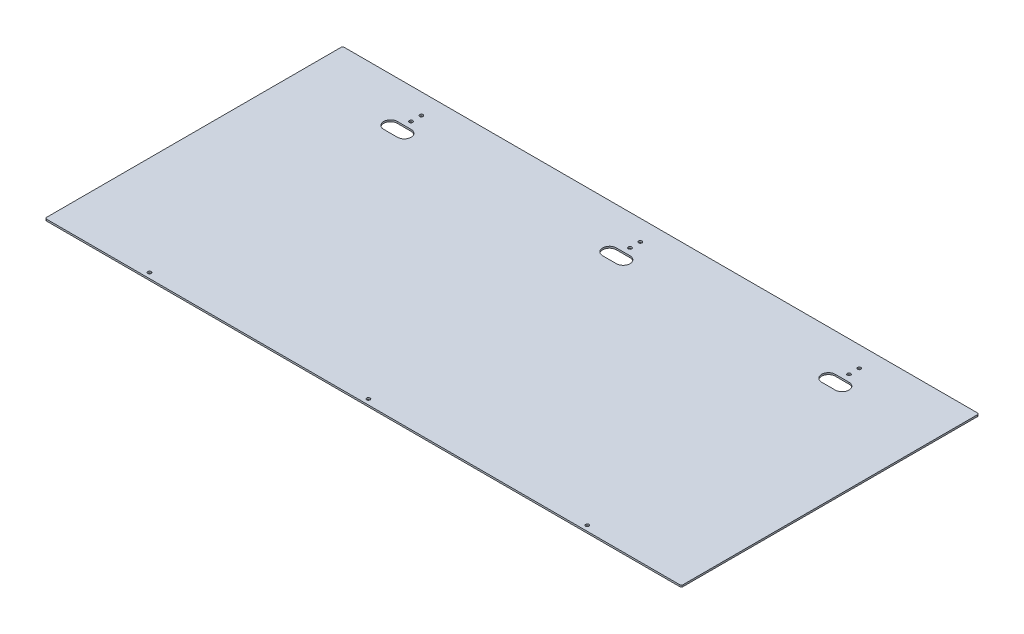
ISO-10303-21;
HEADER;
FILE_DESCRIPTION(('STEP AP214'),'2;1');
FILE_NAME('part.step','',(''),(''),'','','');
FILE_SCHEMA(('AUTOMOTIVE_DESIGN { 1 0 10303 214 1 1 1 1 }'));
ENDSEC;
DATA;
#1=APPLICATION_CONTEXT('core data for automotive mechanical design processes');
#2=APPLICATION_PROTOCOL_DEFINITION('international standard','automotive_design',2000,#1);
#3=PRODUCT_CONTEXT('',#1,'mechanical');
#4=PRODUCT('Part','Part','',(#3));
#5=PRODUCT_RELATED_PRODUCT_CATEGORY('part','',(#4));
#6=PRODUCT_DEFINITION_FORMATION('','',#4);
#7=PRODUCT_DEFINITION_CONTEXT('part definition',#1,'design');
#8=PRODUCT_DEFINITION('design','',#6,#7);
#9=PRODUCT_DEFINITION_SHAPE('','',#8);
#10=(LENGTH_UNIT() NAMED_UNIT(*) SI_UNIT(.MILLI.,.METRE.));
#11=(NAMED_UNIT(*) PLANE_ANGLE_UNIT() SI_UNIT($,.RADIAN.));
#12=(NAMED_UNIT(*) SI_UNIT($,.STERADIAN.) SOLID_ANGLE_UNIT());
#13=UNCERTAINTY_MEASURE_WITH_UNIT(LENGTH_MEASURE(1.E-05),#10,'distance_accuracy_value','');
#14=(GEOMETRIC_REPRESENTATION_CONTEXT(3) GLOBAL_UNCERTAINTY_ASSIGNED_CONTEXT((#13)) GLOBAL_UNIT_ASSIGNED_CONTEXT((#10,
#11,#12)) REPRESENTATION_CONTEXT('',''));
#15=CARTESIAN_POINT('',(0.,0.,0.));
#16=DIRECTION('',(0.,0.,1.));
#17=DIRECTION('',(1.,0.,0.));
#18=AXIS2_PLACEMENT_3D('',#15,#16,#17);
#19=CARTESIAN_POINT('',(587.375,3.175,-273.05));
#20=DIRECTION('',(0.,-1.,0.));
#21=DIRECTION('',(0.,0.,-1.));
#22=AXIS2_PLACEMENT_3D('',#19,#20,#21);
#23=PLANE('',#22);
#24=DIRECTION('',(1.,0.,0.));
#25=VECTOR('',#24,1.);
#26=CARTESIAN_POINT('',(-419.1,3.175,-180.975));
#27=LINE('',#26,#25);
#28=CARTESIAN_POINT('',(-419.1,3.175,-180.975));
#29=VERTEX_POINT('',#28);
#30=CARTESIAN_POINT('',(-393.7,3.175,-180.975));
#31=VERTEX_POINT('',#30);
#32=EDGE_CURVE('E212',#29,#31,#27,.T.);
#33=ORIENTED_EDGE('',*,*,#32,.F.);
#34=CARTESIAN_POINT('',(-419.1,3.175,-193.675));
#35=DIRECTION('',(0.,1.,0.));
#36=DIRECTION('',(0.,0.,1.));
#37=AXIS2_PLACEMENT_3D('',#34,#35,#36);
#38=CIRCLE('',#37,12.7);
#39=CARTESIAN_POINT('',(-419.1,3.175,-206.375));
#40=VERTEX_POINT('',#39);
#41=EDGE_CURVE('E52',#40,#29,#38,.T.);
#42=ORIENTED_EDGE('',*,*,#41,.F.);
#43=DIRECTION('',(-1.,0.,0.));
#44=VECTOR('',#43,1.);
#45=CARTESIAN_POINT('',(-419.1,3.175,-206.375));
#46=LINE('',#45,#44);
#47=CARTESIAN_POINT('',(-393.7,3.175,-206.375));
#48=VERTEX_POINT('',#47);
#49=EDGE_CURVE('E198',#48,#40,#46,.T.);
#50=ORIENTED_EDGE('',*,*,#49,.F.);
#51=CARTESIAN_POINT('',(-393.7,3.175,-193.675));
#52=DIRECTION('',(0.,1.,0.));
#53=DIRECTION('',(0.,0.,1.));
#54=AXIS2_PLACEMENT_3D('',#51,#52,#53);
#55=CIRCLE('',#54,12.7);
#56=EDGE_CURVE('E203',#31,#48,#55,.T.);
#57=ORIENTED_EDGE('',*,*,#56,.F.);
#58=EDGE_LOOP('',(#33,#42,#50,#57));
#59=FACE_BOUND('',#58,.T.);
#60=DIRECTION('',(1.,0.,0.));
#61=VECTOR('',#60,1.);
#62=CARTESIAN_POINT('',(-12.7000000000003,3.175,-180.975));
#63=LINE('',#62,#61);
#64=CARTESIAN_POINT('',(-12.7000000000003,3.175,-180.975));
#65=VERTEX_POINT('',#64);
#66=CARTESIAN_POINT('',(12.6999999999996,3.175,-180.975));
#67=VERTEX_POINT('',#66);
#68=EDGE_CURVE('E248',#65,#67,#63,.T.);
#69=ORIENTED_EDGE('',*,*,#68,.F.);
#70=CARTESIAN_POINT('',(-12.7000000000003,3.175,-193.675));
#71=DIRECTION('',(0.,1.,0.));
#72=DIRECTION('',(0.,0.,1.));
#73=AXIS2_PLACEMENT_3D('',#70,#71,#72);
#74=CIRCLE('',#73,12.7000000000001);
#75=CARTESIAN_POINT('',(-12.7000000000001,3.175,-206.375));
#76=VERTEX_POINT('',#75);
#77=EDGE_CURVE('E60',#76,#65,#74,.T.);
#78=ORIENTED_EDGE('',*,*,#77,.F.);
#79=DIRECTION('',(-1.,0.,0.));
#80=VECTOR('',#79,1.);
#81=CARTESIAN_POINT('',(-12.7000000000001,3.175,-206.375));
#82=LINE('',#81,#80);
#83=CARTESIAN_POINT('',(12.6999999999996,3.175,-206.375));
#84=VERTEX_POINT('',#83);
#85=EDGE_CURVE('E233',#84,#76,#82,.T.);
#86=ORIENTED_EDGE('',*,*,#85,.F.);
#87=CARTESIAN_POINT('',(12.6999999999996,3.175,-193.675));
#88=DIRECTION('',(0.,1.,0.));
#89=DIRECTION('',(0.,0.,1.));
#90=AXIS2_PLACEMENT_3D('',#87,#88,#89);
#91=CIRCLE('',#90,12.7);
#92=EDGE_CURVE('E253',#67,#84,#91,.T.);
#93=ORIENTED_EDGE('',*,*,#92,.F.);
#94=EDGE_LOOP('',(#69,#78,#86,#93));
#95=FACE_BOUND('',#94,.T.);
#96=DIRECTION('',(1.,0.,0.));
#97=VECTOR('',#96,1.);
#98=CARTESIAN_POINT('',(393.7,3.175,-180.975));
#99=LINE('',#98,#97);
#100=CARTESIAN_POINT('',(393.7,3.175,-180.975));
#101=VERTEX_POINT('',#100);
#102=CARTESIAN_POINT('',(419.1,3.175,-180.975));
#103=VERTEX_POINT('',#102);
#104=EDGE_CURVE('E291',#101,#103,#99,.T.);
#105=ORIENTED_EDGE('',*,*,#104,.F.);
#106=CARTESIAN_POINT('',(393.7,3.175,-193.675));
#107=DIRECTION('',(0.,1.,0.));
#108=DIRECTION('',(0.,0.,1.));
#109=AXIS2_PLACEMENT_3D('',#106,#107,#108);
#110=CIRCLE('',#109,12.7);
#111=CARTESIAN_POINT('',(393.7,3.175,-206.375));
#112=VERTEX_POINT('',#111);
#113=EDGE_CURVE('E288',#112,#101,#110,.T.);
#114=ORIENTED_EDGE('',*,*,#113,.F.);
#115=DIRECTION('',(-1.,0.,0.));
#116=VECTOR('',#115,1.);
#117=CARTESIAN_POINT('',(393.7,3.175,-206.375));
#118=LINE('',#117,#116);
#119=CARTESIAN_POINT('',(419.1,3.175,-206.375));
#120=VERTEX_POINT('',#119);
#121=EDGE_CURVE('E275',#120,#112,#118,.T.);
#122=ORIENTED_EDGE('',*,*,#121,.F.);
#123=CARTESIAN_POINT('',(419.1,3.175,-193.675));
#124=DIRECTION('',(0.,1.,0.));
#125=DIRECTION('',(0.,0.,1.));
#126=AXIS2_PLACEMENT_3D('',#123,#124,#125);
#127=CIRCLE('',#126,12.7);
#128=EDGE_CURVE('E295',#103,#120,#127,.T.);
#129=ORIENTED_EDGE('',*,*,#128,.F.);
#130=EDGE_LOOP('',(#105,#114,#122,#129));
#131=FACE_BOUND('',#130,.T.);
#132=CARTESIAN_POINT('',(-406.4,3.175,-219.075));
#133=DIRECTION('',(0.,1.,0.));
#134=DIRECTION('',(0.,0.,1.));
#135=AXIS2_PLACEMENT_3D('',#132,#133,#134);
#136=CIRCLE('',#135,3.17499999999998);
#137=CARTESIAN_POINT('',(-406.4,3.175,-215.9));
#138=VERTEX_POINT('',#137);
#139=EDGE_CURVE('E222',#138,#138,#136,.T.);
#140=ORIENTED_EDGE('',*,*,#139,.F.);
#141=EDGE_LOOP('',(#140));
#142=FACE_BOUND('',#141,.T.);
#143=CARTESIAN_POINT('',(0.,3.175,-219.075));
#144=DIRECTION('',(0.,1.,0.));
#145=DIRECTION('',(0.,0.,1.));
#146=AXIS2_PLACEMENT_3D('',#143,#144,#145);
#147=CIRCLE('',#146,3.175);
#148=CARTESIAN_POINT('',(0.,3.175,-215.9));
#149=VERTEX_POINT('',#148);
#150=EDGE_CURVE('E320',#149,#149,#147,.T.);
#151=ORIENTED_EDGE('',*,*,#150,.F.);
#152=EDGE_LOOP('',(#151));
#153=FACE_BOUND('',#152,.T.);
#154=CARTESIAN_POINT('',(406.4,3.175,-219.075));
#155=DIRECTION('',(0.,1.,0.));
#156=DIRECTION('',(0.,0.,1.));
#157=AXIS2_PLACEMENT_3D('',#154,#155,#156);
#158=CIRCLE('',#157,3.17499999999998);
#159=CARTESIAN_POINT('',(406.4,3.175,-215.9));
#160=VERTEX_POINT('',#159);
#161=EDGE_CURVE('E328',#160,#160,#158,.T.);
#162=ORIENTED_EDGE('',*,*,#161,.F.);
#163=EDGE_LOOP('',(#162));
#164=FACE_BOUND('',#163,.T.);
#165=CARTESIAN_POINT('',(-406.4,3.175,266.573));
#166=DIRECTION('',(0.,1.,0.));
#167=DIRECTION('',(0.,0.,1.));
#168=AXIS2_PLACEMENT_3D('',#165,#166,#167);
#169=CIRCLE('',#168,3.17499999999998);
#170=CARTESIAN_POINT('',(-406.4,3.175,269.748));
#171=VERTEX_POINT('',#170);
#172=EDGE_CURVE('E336',#171,#171,#169,.T.);
#173=ORIENTED_EDGE('',*,*,#172,.F.);
#174=EDGE_LOOP('',(#173));
#175=FACE_BOUND('',#174,.T.);
#176=CARTESIAN_POINT('',(-3.33066907387547E-13,3.175,266.573));
#177=DIRECTION('',(0.,1.,0.));
#178=DIRECTION('',(0.,0.,1.));
#179=AXIS2_PLACEMENT_3D('',#176,#177,#178);
#180=CIRCLE('',#179,3.175);
#181=CARTESIAN_POINT('',(-3.33066907387547E-13,3.175,269.748));
#182=VERTEX_POINT('',#181);
#183=EDGE_CURVE('E344',#182,#182,#180,.T.);
#184=ORIENTED_EDGE('',*,*,#183,.F.);
#185=EDGE_LOOP('',(#184));
#186=FACE_BOUND('',#185,.T.);
#187=CARTESIAN_POINT('',(406.4,3.175,266.573));
#188=DIRECTION('',(0.,1.,0.));
#189=DIRECTION('',(0.,0.,1.));
#190=AXIS2_PLACEMENT_3D('',#187,#188,#189);
#191=CIRCLE('',#190,3.17499999999998);
#192=CARTESIAN_POINT('',(406.4,3.175,269.748));
#193=VERTEX_POINT('',#192);
#194=EDGE_CURVE('E352',#193,#193,#191,.T.);
#195=ORIENTED_EDGE('',*,*,#194,.F.);
#196=EDGE_LOOP('',(#195));
#197=FACE_BOUND('',#196,.T.);
#198=CARTESIAN_POINT('',(-406.399999999992,3.175,-238.125));
#199=DIRECTION('',(0.,1.,0.));
#200=DIRECTION('',(0.,0.,1.));
#201=AXIS2_PLACEMENT_3D('',#198,#199,#200);
#202=CIRCLE('',#201,3.17499999999998);
#203=CARTESIAN_POINT('',(-406.399999999992,3.175,-234.95));
#204=VERTEX_POINT('',#203);
#205=EDGE_CURVE('E360',#204,#204,#202,.T.);
#206=ORIENTED_EDGE('',*,*,#205,.F.);
#207=EDGE_LOOP('',(#206));
#208=FACE_BOUND('',#207,.T.);
#209=CARTESIAN_POINT('',(406.400000000008,3.175,-238.125));
#210=DIRECTION('',(0.,1.,0.));
#211=DIRECTION('',(0.,0.,1.));
#212=AXIS2_PLACEMENT_3D('',#209,#210,#211);
#213=CIRCLE('',#212,3.17499999999998);
#214=CARTESIAN_POINT('',(406.400000000008,3.175,-234.95));
#215=VERTEX_POINT('',#214);
#216=EDGE_CURVE('E376',#215,#215,#213,.T.);
#217=ORIENTED_EDGE('',*,*,#216,.F.);
#218=EDGE_LOOP('',(#217));
#219=FACE_BOUND('',#218,.T.);
#220=CARTESIAN_POINT('',(587.375,3.175,-273.05));
#221=DIRECTION('',(0.,1.,0.));
#222=DIRECTION('',(0.,0.,-1.));
#223=AXIS2_PLACEMENT_3D('',#220,#221,#222);
#224=CIRCLE('',#223,3.17500000000001);
#225=CARTESIAN_POINT('',(590.55,3.175,-273.05));
#226=VERTEX_POINT('',#225);
#227=CARTESIAN_POINT('',(587.375,3.175,-276.225));
#228=VERTEX_POINT('',#227);
#229=EDGE_CURVE('E385',#226,#228,#224,.T.);
#230=ORIENTED_EDGE('',*,*,#229,.T.);
#231=DIRECTION('',(-1.,0.,0.));
#232=VECTOR('',#231,1.);
#233=CARTESIAN_POINT('',(-587.375,3.175,-276.225));
#234=LINE('',#233,#232);
#235=CARTESIAN_POINT('',(-587.375,3.175,-276.225));
#236=VERTEX_POINT('',#235);
#237=EDGE_CURVE('E389',#228,#236,#234,.T.);
#238=ORIENTED_EDGE('',*,*,#237,.T.);
#239=CARTESIAN_POINT('',(-587.375,3.175,-273.05));
#240=DIRECTION('',(0.,1.,0.));
#241=DIRECTION('',(0.,0.,-1.));
#242=AXIS2_PLACEMENT_3D('',#239,#240,#241);
#243=CIRCLE('',#242,3.17500000000001);
#244=CARTESIAN_POINT('',(-590.55,3.175,-273.05));
#245=VERTEX_POINT('',#244);
#246=EDGE_CURVE('E393',#236,#245,#243,.T.);
#247=ORIENTED_EDGE('',*,*,#246,.T.);
#248=DIRECTION('',(0.,0.,1.));
#249=VECTOR('',#248,1.);
#250=CARTESIAN_POINT('',(-590.55,3.175,273.05));
#251=LINE('',#250,#249);
#252=CARTESIAN_POINT('',(-590.55,3.175,273.05));
#253=VERTEX_POINT('',#252);
#254=EDGE_CURVE('E396',#245,#253,#251,.T.);
#255=ORIENTED_EDGE('',*,*,#254,.T.);
#256=CARTESIAN_POINT('',(-587.375,3.175,273.05));
#257=DIRECTION('',(0.,1.,0.));
#258=DIRECTION('',(0.,0.,-1.));
#259=AXIS2_PLACEMENT_3D('',#256,#257,#258);
#260=CIRCLE('',#259,3.17500000000001);
#261=CARTESIAN_POINT('',(-587.375,3.175,276.225));
#262=VERTEX_POINT('',#261);
#263=EDGE_CURVE('E399',#253,#262,#260,.T.);
#264=ORIENTED_EDGE('',*,*,#263,.T.);
#265=DIRECTION('',(1.,0.,0.));
#266=VECTOR('',#265,1.);
#267=CARTESIAN_POINT('',(-587.375,3.175,276.225));
#268=LINE('',#267,#266);
#269=CARTESIAN_POINT('',(587.375,3.175,276.225));
#270=VERTEX_POINT('',#269);
#271=EDGE_CURVE('E402',#262,#270,#268,.T.);
#272=ORIENTED_EDGE('',*,*,#271,.T.);
#273=CARTESIAN_POINT('',(587.375,3.175,273.05));
#274=DIRECTION('',(0.,1.,0.));
#275=DIRECTION('',(0.,0.,1.));
#276=AXIS2_PLACEMENT_3D('',#273,#274,#275);
#277=CIRCLE('',#276,3.17500000000001);
#278=CARTESIAN_POINT('',(590.55,3.175,273.05));
#279=VERTEX_POINT('',#278);
#280=EDGE_CURVE('E405',#270,#279,#277,.T.);
#281=ORIENTED_EDGE('',*,*,#280,.T.);
#282=DIRECTION('',(0.,0.,-1.));
#283=VECTOR('',#282,1.);
#284=CARTESIAN_POINT('',(590.55,3.175,273.05));
#285=LINE('',#284,#283);
#286=EDGE_CURVE('E408',#279,#226,#285,.T.);
#287=ORIENTED_EDGE('',*,*,#286,.T.);
#288=EDGE_LOOP('',(#230,#238,#247,#255,#264,#272,#281,#287));
#289=FACE_BOUND('',#288,.T.);
#290=CARTESIAN_POINT('',(7.58551960798949E-12,3.175,-238.125));
#291=DIRECTION('',(0.,1.,0.));
#292=DIRECTION('',(0.,0.,1.));
#293=AXIS2_PLACEMENT_3D('',#290,#291,#292);
#294=CIRCLE('',#293,3.175);
#295=CARTESIAN_POINT('',(7.58551960798949E-12,3.175,-234.95));
#296=VERTEX_POINT('',#295);
#297=EDGE_CURVE('E368',#296,#296,#294,.T.);
#298=ORIENTED_EDGE('',*,*,#297,.F.);
#299=EDGE_LOOP('',(#298));
#300=FACE_BOUND('',#299,.T.);
#301=ADVANCED_FACE('F36',(#59,#95,#131,#142,#153,#164,#175,#186,#197,#208,#219,#289,#300),#23,.F.);
#302=CARTESIAN_POINT('',(587.375,0.,-273.05));
#303=DIRECTION('',(0.,-1.,0.));
#304=DIRECTION('',(0.,0.,-1.));
#305=AXIS2_PLACEMENT_3D('',#302,#303,#304);
#306=PLANE('',#305);
#307=CARTESIAN_POINT('',(-419.1,0.,-193.675));
#308=DIRECTION('',(0.,1.,0.));
#309=DIRECTION('',(0.,0.,1.));
#310=AXIS2_PLACEMENT_3D('',#307,#308,#309);
#311=CIRCLE('',#310,12.7);
#312=CARTESIAN_POINT('',(-419.1,0.,-206.375));
#313=VERTEX_POINT('',#312);
#314=CARTESIAN_POINT('',(-419.1,0.,-180.975));
#315=VERTEX_POINT('',#314);
#316=EDGE_CURVE('E176',#313,#315,#311,.T.);
#317=ORIENTED_EDGE('',*,*,#316,.T.);
#318=DIRECTION('',(1.,0.,0.));
#319=VECTOR('',#318,1.);
#320=CARTESIAN_POINT('',(-419.1,0.,-180.975));
#321=LINE('',#320,#319);
#322=CARTESIAN_POINT('',(-393.7,0.,-180.975));
#323=VERTEX_POINT('',#322);
#324=EDGE_CURVE('E187',#315,#323,#321,.T.);
#325=ORIENTED_EDGE('',*,*,#324,.T.);
#326=CARTESIAN_POINT('',(-393.7,0.,-193.675));
#327=DIRECTION('',(0.,1.,0.));
#328=DIRECTION('',(0.,0.,1.));
#329=AXIS2_PLACEMENT_3D('',#326,#327,#328);
#330=CIRCLE('',#329,12.7);
#331=CARTESIAN_POINT('',(-393.7,0.,-206.375));
#332=VERTEX_POINT('',#331);
#333=EDGE_CURVE('E192',#323,#332,#330,.T.);
#334=ORIENTED_EDGE('',*,*,#333,.T.);
#335=DIRECTION('',(-1.,0.,0.));
#336=VECTOR('',#335,1.);
#337=CARTESIAN_POINT('',(-419.1,0.,-206.375));
#338=LINE('',#337,#336);
#339=EDGE_CURVE('E183',#332,#313,#338,.T.);
#340=ORIENTED_EDGE('',*,*,#339,.T.);
#341=EDGE_LOOP('',(#317,#325,#334,#340));
#342=FACE_BOUND('',#341,.T.);
#343=CARTESIAN_POINT('',(-12.7000000000003,0.,-193.675));
#344=DIRECTION('',(0.,1.,0.));
#345=DIRECTION('',(0.,0.,1.));
#346=AXIS2_PLACEMENT_3D('',#343,#344,#345);
#347=CIRCLE('',#346,12.7000000000001);
#348=CARTESIAN_POINT('',(-12.7000000000001,0.,-206.375));
#349=VERTEX_POINT('',#348);
#350=CARTESIAN_POINT('',(-12.7000000000003,0.,-180.975));
#351=VERTEX_POINT('',#350);
#352=EDGE_CURVE('E228',#349,#351,#347,.T.);
#353=ORIENTED_EDGE('',*,*,#352,.T.);
#354=DIRECTION('',(1.,0.,0.));
#355=VECTOR('',#354,1.);
#356=CARTESIAN_POINT('',(-12.7000000000003,0.,-180.975));
#357=LINE('',#356,#355);
#358=CARTESIAN_POINT('',(12.6999999999996,0.,-180.975));
#359=VERTEX_POINT('',#358);
#360=EDGE_CURVE('E232',#351,#359,#357,.T.);
#361=ORIENTED_EDGE('',*,*,#360,.T.);
#362=CARTESIAN_POINT('',(12.6999999999996,0.,-193.675));
#363=DIRECTION('',(0.,1.,0.));
#364=DIRECTION('',(0.,0.,1.));
#365=AXIS2_PLACEMENT_3D('',#362,#363,#364);
#366=CIRCLE('',#365,12.7);
#367=CARTESIAN_POINT('',(12.6999999999996,0.,-206.375));
#368=VERTEX_POINT('',#367);
#369=EDGE_CURVE('E237',#359,#368,#366,.T.);
#370=ORIENTED_EDGE('',*,*,#369,.T.);
#371=DIRECTION('',(-1.,0.,0.));
#372=VECTOR('',#371,1.);
#373=CARTESIAN_POINT('',(-12.7000000000001,0.,-206.375));
#374=LINE('',#373,#372);
#375=EDGE_CURVE('E241',#368,#349,#374,.T.);
#376=ORIENTED_EDGE('',*,*,#375,.T.);
#377=EDGE_LOOP('',(#353,#361,#370,#376));
#378=FACE_BOUND('',#377,.T.);
#379=CARTESIAN_POINT('',(393.7,0.,-193.675));
#380=DIRECTION('',(0.,1.,0.));
#381=DIRECTION('',(0.,0.,1.));
#382=AXIS2_PLACEMENT_3D('',#379,#380,#381);
#383=CIRCLE('',#382,12.7);
#384=CARTESIAN_POINT('',(393.7,0.,-206.375));
#385=VERTEX_POINT('',#384);
#386=CARTESIAN_POINT('',(393.7,0.,-180.975));
#387=VERTEX_POINT('',#386);
#388=EDGE_CURVE('E270',#385,#387,#383,.T.);
#389=ORIENTED_EDGE('',*,*,#388,.T.);
#390=DIRECTION('',(1.,0.,0.));
#391=VECTOR('',#390,1.);
#392=CARTESIAN_POINT('',(393.7,0.,-180.975));
#393=LINE('',#392,#391);
#394=CARTESIAN_POINT('',(419.1,0.,-180.975));
#395=VERTEX_POINT('',#394);
#396=EDGE_CURVE('E274',#387,#395,#393,.T.);
#397=ORIENTED_EDGE('',*,*,#396,.T.);
#398=CARTESIAN_POINT('',(419.1,0.,-193.675));
#399=DIRECTION('',(0.,1.,0.));
#400=DIRECTION('',(0.,0.,1.));
#401=AXIS2_PLACEMENT_3D('',#398,#399,#400);
#402=CIRCLE('',#401,12.7);
#403=CARTESIAN_POINT('',(419.1,0.,-206.375));
#404=VERTEX_POINT('',#403);
#405=EDGE_CURVE('E279',#395,#404,#402,.T.);
#406=ORIENTED_EDGE('',*,*,#405,.T.);
#407=DIRECTION('',(-1.,0.,0.));
#408=VECTOR('',#407,1.);
#409=CARTESIAN_POINT('',(393.7,0.,-206.375));
#410=LINE('',#409,#408);
#411=EDGE_CURVE('E283',#404,#385,#410,.T.);
#412=ORIENTED_EDGE('',*,*,#411,.T.);
#413=EDGE_LOOP('',(#389,#397,#406,#412));
#414=FACE_BOUND('',#413,.T.);
#415=CARTESIAN_POINT('',(-406.4,0.,-219.075));
#416=DIRECTION('',(0.,1.,0.));
#417=DIRECTION('',(0.,0.,1.));
#418=AXIS2_PLACEMENT_3D('',#415,#416,#417);
#419=CIRCLE('',#418,3.17499999999998);
#420=CARTESIAN_POINT('',(-406.4,0.,-215.9));
#421=VERTEX_POINT('',#420);
#422=EDGE_CURVE('E316',#421,#421,#419,.T.);
#423=ORIENTED_EDGE('',*,*,#422,.T.);
#424=EDGE_LOOP('',(#423));
#425=FACE_BOUND('',#424,.T.);
#426=CARTESIAN_POINT('',(0.,0.,-219.075));
#427=DIRECTION('',(0.,1.,0.));
#428=DIRECTION('',(0.,0.,1.));
#429=AXIS2_PLACEMENT_3D('',#426,#427,#428);
#430=CIRCLE('',#429,3.175);
#431=CARTESIAN_POINT('',(0.,0.,-215.9));
#432=VERTEX_POINT('',#431);
#433=EDGE_CURVE('E324',#432,#432,#430,.T.);
#434=ORIENTED_EDGE('',*,*,#433,.T.);
#435=EDGE_LOOP('',(#434));
#436=FACE_BOUND('',#435,.T.);
#437=CARTESIAN_POINT('',(406.4,0.,-219.075));
#438=DIRECTION('',(0.,1.,0.));
#439=DIRECTION('',(0.,0.,1.));
#440=AXIS2_PLACEMENT_3D('',#437,#438,#439);
#441=CIRCLE('',#440,3.17499999999998);
#442=CARTESIAN_POINT('',(406.4,0.,-215.9));
#443=VERTEX_POINT('',#442);
#444=EDGE_CURVE('E332',#443,#443,#441,.T.);
#445=ORIENTED_EDGE('',*,*,#444,.T.);
#446=EDGE_LOOP('',(#445));
#447=FACE_BOUND('',#446,.T.);
#448=CARTESIAN_POINT('',(-406.4,0.,266.573));
#449=DIRECTION('',(0.,1.,0.));
#450=DIRECTION('',(0.,0.,1.));
#451=AXIS2_PLACEMENT_3D('',#448,#449,#450);
#452=CIRCLE('',#451,3.17499999999998);
#453=CARTESIAN_POINT('',(-406.4,0.,269.748));
#454=VERTEX_POINT('',#453);
#455=EDGE_CURVE('E340',#454,#454,#452,.T.);
#456=ORIENTED_EDGE('',*,*,#455,.T.);
#457=EDGE_LOOP('',(#456));
#458=FACE_BOUND('',#457,.T.);
#459=CARTESIAN_POINT('',(-3.33066907387547E-13,0.,266.573));
#460=DIRECTION('',(0.,1.,0.));
#461=DIRECTION('',(0.,0.,1.));
#462=AXIS2_PLACEMENT_3D('',#459,#460,#461);
#463=CIRCLE('',#462,3.175);
#464=CARTESIAN_POINT('',(-3.33066907387547E-13,0.,269.748));
#465=VERTEX_POINT('',#464);
#466=EDGE_CURVE('E348',#465,#465,#463,.T.);
#467=ORIENTED_EDGE('',*,*,#466,.T.);
#468=EDGE_LOOP('',(#467));
#469=FACE_BOUND('',#468,.T.);
#470=CARTESIAN_POINT('',(406.4,0.,266.573));
#471=DIRECTION('',(0.,1.,0.));
#472=DIRECTION('',(0.,0.,1.));
#473=AXIS2_PLACEMENT_3D('',#470,#471,#472);
#474=CIRCLE('',#473,3.17499999999998);
#475=CARTESIAN_POINT('',(406.4,0.,269.748));
#476=VERTEX_POINT('',#475);
#477=EDGE_CURVE('E356',#476,#476,#474,.T.);
#478=ORIENTED_EDGE('',*,*,#477,.T.);
#479=EDGE_LOOP('',(#478));
#480=FACE_BOUND('',#479,.T.);
#481=CARTESIAN_POINT('',(-406.399999999992,0.,-238.125));
#482=DIRECTION('',(0.,1.,0.));
#483=DIRECTION('',(0.,0.,1.));
#484=AXIS2_PLACEMENT_3D('',#481,#482,#483);
#485=CIRCLE('',#484,3.17499999999998);
#486=CARTESIAN_POINT('',(-406.399999999992,0.,-234.95));
#487=VERTEX_POINT('',#486);
#488=EDGE_CURVE('E364',#487,#487,#485,.T.);
#489=ORIENTED_EDGE('',*,*,#488,.T.);
#490=EDGE_LOOP('',(#489));
#491=FACE_BOUND('',#490,.T.);
#492=CARTESIAN_POINT('',(7.58551960798949E-12,0.,-238.125));
#493=DIRECTION('',(0.,1.,0.));
#494=DIRECTION('',(0.,0.,1.));
#495=AXIS2_PLACEMENT_3D('',#492,#493,#494);
#496=CIRCLE('',#495,3.175);
#497=CARTESIAN_POINT('',(7.58551960798949E-12,0.,-234.95));
#498=VERTEX_POINT('',#497);
#499=EDGE_CURVE('E372',#498,#498,#496,.T.);
#500=ORIENTED_EDGE('',*,*,#499,.T.);
#501=EDGE_LOOP('',(#500));
#502=FACE_BOUND('',#501,.T.);
#503=CARTESIAN_POINT('',(587.375,0.,-273.05));
#504=DIRECTION('',(0.,1.,0.));
#505=DIRECTION('',(0.,0.,-1.));
#506=AXIS2_PLACEMENT_3D('',#503,#504,#505);
#507=CIRCLE('',#506,3.17500000000001);
#508=CARTESIAN_POINT('',(590.55,0.,-273.05));
#509=VERTEX_POINT('',#508);
#510=CARTESIAN_POINT('',(587.375,0.,-276.225));
#511=VERTEX_POINT('',#510);
#512=EDGE_CURVE('E384',#509,#511,#507,.T.);
#513=ORIENTED_EDGE('',*,*,#512,.F.);
#514=DIRECTION('',(0.,0.,-1.));
#515=VECTOR('',#514,1.);
#516=CARTESIAN_POINT('',(590.55,0.,273.05));
#517=LINE('',#516,#515);
#518=CARTESIAN_POINT('',(590.55,0.,273.05));
#519=VERTEX_POINT('',#518);
#520=EDGE_CURVE('E390',#519,#509,#517,.T.);
#521=ORIENTED_EDGE('',*,*,#520,.F.);
#522=CARTESIAN_POINT('',(587.375,0.,273.05));
#523=DIRECTION('',(0.,1.,0.));
#524=DIRECTION('',(0.,0.,1.));
#525=AXIS2_PLACEMENT_3D('',#522,#523,#524);
#526=CIRCLE('',#525,3.17500000000001);
#527=CARTESIAN_POINT('',(587.375,0.,276.225));
#528=VERTEX_POINT('',#527);
#529=EDGE_CURVE('E430',#528,#519,#526,.T.);
#530=ORIENTED_EDGE('',*,*,#529,.F.);
#531=DIRECTION('',(1.,0.,0.));
#532=VECTOR('',#531,1.);
#533=CARTESIAN_POINT('',(-587.375,0.,276.225));
#534=LINE('',#533,#532);
#535=CARTESIAN_POINT('',(-587.375,0.,276.225));
#536=VERTEX_POINT('',#535);
#537=EDGE_CURVE('E427',#536,#528,#534,.T.);
#538=ORIENTED_EDGE('',*,*,#537,.F.);
#539=CARTESIAN_POINT('',(-587.375,0.,273.05));
#540=DIRECTION('',(0.,1.,0.));
#541=DIRECTION('',(0.,0.,-1.));
#542=AXIS2_PLACEMENT_3D('',#539,#540,#541);
#543=CIRCLE('',#542,3.17500000000001);
#544=CARTESIAN_POINT('',(-590.55,0.,273.05));
#545=VERTEX_POINT('',#544);
#546=EDGE_CURVE('E424',#545,#536,#543,.T.);
#547=ORIENTED_EDGE('',*,*,#546,.F.);
#548=DIRECTION('',(0.,0.,1.));
#549=VECTOR('',#548,1.);
#550=CARTESIAN_POINT('',(-590.55,0.,273.05));
#551=LINE('',#550,#549);
#552=CARTESIAN_POINT('',(-590.55,0.,-273.05));
#553=VERTEX_POINT('',#552);
#554=EDGE_CURVE('E421',#553,#545,#551,.T.);
#555=ORIENTED_EDGE('',*,*,#554,.F.);
#556=CARTESIAN_POINT('',(-587.375,0.,-273.05));
#557=DIRECTION('',(0.,1.,0.));
#558=DIRECTION('',(0.,0.,-1.));
#559=AXIS2_PLACEMENT_3D('',#556,#557,#558);
#560=CIRCLE('',#559,3.17500000000001);
#561=CARTESIAN_POINT('',(-587.375,0.,-276.225));
#562=VERTEX_POINT('',#561);
#563=EDGE_CURVE('E418',#562,#553,#560,.T.);
#564=ORIENTED_EDGE('',*,*,#563,.F.);
#565=DIRECTION('',(-1.,0.,0.));
#566=VECTOR('',#565,1.);
#567=CARTESIAN_POINT('',(-587.375,0.,-276.225));
#568=LINE('',#567,#566);
#569=EDGE_CURVE('E415',#511,#562,#568,.T.);
#570=ORIENTED_EDGE('',*,*,#569,.F.);
#571=EDGE_LOOP('',(#513,#521,#530,#538,#547,#555,#564,#570));
#572=FACE_BOUND('',#571,.T.);
#573=CARTESIAN_POINT('',(406.400000000008,0.,-238.125));
#574=DIRECTION('',(0.,1.,0.));
#575=DIRECTION('',(0.,0.,1.));
#576=AXIS2_PLACEMENT_3D('',#573,#574,#575);
#577=CIRCLE('',#576,3.17499999999998);
#578=CARTESIAN_POINT('',(406.400000000008,0.,-234.95));
#579=VERTEX_POINT('',#578);
#580=EDGE_CURVE('E380',#579,#579,#577,.T.);
#581=ORIENTED_EDGE('',*,*,#580,.T.);
#582=EDGE_LOOP('',(#581));
#583=FACE_BOUND('',#582,.T.);
#584=ADVANCED_FACE('F194',(#342,#378,#414,#425,#436,#447,#458,#469,#480,#491,#502,#572,#583),
#306,.T.);
#585=CARTESIAN_POINT('',(587.375,3.175,-273.05));
#586=DIRECTION('',(0.,-1.,0.));
#587=DIRECTION('',(0.,0.,-1.));
#588=AXIS2_PLACEMENT_3D('',#585,#586,#587);
#589=CYLINDRICAL_SURFACE('',#588,3.17500000000001);
#590=ORIENTED_EDGE('',*,*,#512,.T.);
#591=DIRECTION('',(0.,-1.,0.));
#592=VECTOR('',#591,1.);
#593=CARTESIAN_POINT('',(587.375,3.175,-276.225));
#594=LINE('',#593,#592);
#595=EDGE_CURVE('E11',#228,#511,#594,.T.);
#596=ORIENTED_EDGE('',*,*,#595,.F.);
#597=ORIENTED_EDGE('',*,*,#229,.F.);
#598=DIRECTION('',(0.,-1.,0.));
#599=VECTOR('',#598,1.);
#600=CARTESIAN_POINT('',(590.55,3.175,-273.05));
#601=LINE('',#600,#599);
#602=EDGE_CURVE('E411',#226,#509,#601,.T.);
#603=ORIENTED_EDGE('',*,*,#602,.T.);
#604=EDGE_LOOP('',(#590,#596,#597,#603));
#605=FACE_BOUND('',#604,.T.);
#606=ADVANCED_FACE('F38',(#605),#589,.T.);
#607=CARTESIAN_POINT('',(-587.375,3.175,-276.225));
#608=DIRECTION('',(0.,0.,1.));
#609=DIRECTION('',(1.,0.,0.));
#610=AXIS2_PLACEMENT_3D('',#607,#608,#609);
#611=PLANE('',#610);
#612=ORIENTED_EDGE('',*,*,#569,.T.);
#613=DIRECTION('',(0.,-1.,0.));
#614=VECTOR('',#613,1.);
#615=CARTESIAN_POINT('',(-587.375,3.175,-276.225));
#616=LINE('',#615,#614);
#617=EDGE_CURVE('E45',#236,#562,#616,.T.);
#618=ORIENTED_EDGE('',*,*,#617,.F.);
#619=ORIENTED_EDGE('',*,*,#237,.F.);
#620=ORIENTED_EDGE('',*,*,#595,.T.);
#621=EDGE_LOOP('',(#612,#618,#619,#620));
#622=FACE_BOUND('',#621,.T.);
#623=ADVANCED_FACE('F487',(#622),#611,.F.);
#624=CARTESIAN_POINT('',(-587.375,3.175,-273.05));
#625=DIRECTION('',(0.,-1.,0.));
#626=DIRECTION('',(0.,0.,-1.));
#627=AXIS2_PLACEMENT_3D('',#624,#625,#626);
#628=CYLINDRICAL_SURFACE('',#627,3.17500000000001);
#629=ORIENTED_EDGE('',*,*,#563,.T.);
#630=DIRECTION('',(0.,-1.,0.));
#631=VECTOR('',#630,1.);
#632=CARTESIAN_POINT('',(-590.55,3.175,-273.05));
#633=LINE('',#632,#631);
#634=EDGE_CURVE('E454',#245,#553,#633,.T.);
#635=ORIENTED_EDGE('',*,*,#634,.F.);
#636=ORIENTED_EDGE('',*,*,#246,.F.);
#637=ORIENTED_EDGE('',*,*,#617,.T.);
#638=EDGE_LOOP('',(#629,#635,#636,#637));
#639=FACE_BOUND('',#638,.T.);
#640=ADVANCED_FACE('F464',(#639),#628,.T.);
#641=CARTESIAN_POINT('',(-590.55,3.175,273.05));
#642=DIRECTION('',(1.,0.,0.));
#643=DIRECTION('',(0.,0.,-1.));
#644=AXIS2_PLACEMENT_3D('',#641,#642,#643);
#645=PLANE('',#644);
#646=ORIENTED_EDGE('',*,*,#554,.T.);
#647=DIRECTION('',(0.,-1.,0.));
#648=VECTOR('',#647,1.);
#649=CARTESIAN_POINT('',(-590.55,3.175,273.05));
#650=LINE('',#649,#648);
#651=EDGE_CURVE('E450',#253,#545,#650,.T.);
#652=ORIENTED_EDGE('',*,*,#651,.F.);
#653=ORIENTED_EDGE('',*,*,#254,.F.);
#654=ORIENTED_EDGE('',*,*,#634,.T.);
#655=EDGE_LOOP('',(#646,#652,#653,#654));
#656=FACE_BOUND('',#655,.T.);
#657=ADVANCED_FACE('F475',(#656),#645,.F.);
#658=CARTESIAN_POINT('',(-587.375,3.175,273.05));
#659=DIRECTION('',(0.,-1.,0.));
#660=DIRECTION('',(0.,0.,-1.));
#661=AXIS2_PLACEMENT_3D('',#658,#659,#660);
#662=CYLINDRICAL_SURFACE('',#661,3.17500000000001);
#663=ORIENTED_EDGE('',*,*,#546,.T.);
#664=DIRECTION('',(0.,-1.,0.));
#665=VECTOR('',#664,1.);
#666=CARTESIAN_POINT('',(-587.375,3.175,276.225));
#667=LINE('',#666,#665);
#668=EDGE_CURVE('E446',#262,#536,#667,.T.);
#669=ORIENTED_EDGE('',*,*,#668,.F.);
#670=ORIENTED_EDGE('',*,*,#263,.F.);
#671=ORIENTED_EDGE('',*,*,#651,.T.);
#672=EDGE_LOOP('',(#663,#669,#670,#671));
#673=FACE_BOUND('',#672,.T.);
#674=ADVANCED_FACE('F479',(#673),#662,.T.);
#675=CARTESIAN_POINT('',(-587.375,3.175,276.225));
#676=DIRECTION('',(0.,0.,-1.));
#677=DIRECTION('',(-1.,0.,0.));
#678=AXIS2_PLACEMENT_3D('',#675,#676,#677);
#679=PLANE('',#678);
#680=ORIENTED_EDGE('',*,*,#537,.T.);
#681=DIRECTION('',(0.,-1.,0.));
#682=VECTOR('',#681,1.);
#683=CARTESIAN_POINT('',(587.375,3.175,276.225));
#684=LINE('',#683,#682);
#685=EDGE_CURVE('E442',#270,#528,#684,.T.);
#686=ORIENTED_EDGE('',*,*,#685,.F.);
#687=ORIENTED_EDGE('',*,*,#271,.F.);
#688=ORIENTED_EDGE('',*,*,#668,.T.);
#689=EDGE_LOOP('',(#680,#686,#687,#688));
#690=FACE_BOUND('',#689,.T.);
#691=ADVANCED_FACE('F500',(#690),#679,.F.);
#692=CARTESIAN_POINT('',(587.375,3.175,273.05));
#693=DIRECTION('',(0.,-1.,0.));
#694=DIRECTION('',(0.,0.,-1.));
#695=AXIS2_PLACEMENT_3D('',#692,#693,#694);
#696=CYLINDRICAL_SURFACE('',#695,3.17500000000001);
#697=ORIENTED_EDGE('',*,*,#529,.T.);
#698=DIRECTION('',(0.,-1.,0.));
#699=VECTOR('',#698,1.);
#700=CARTESIAN_POINT('',(590.55,3.175,273.05));
#701=LINE('',#700,#699);
#702=EDGE_CURVE('E438',#279,#519,#701,.T.);
#703=ORIENTED_EDGE('',*,*,#702,.F.);
#704=ORIENTED_EDGE('',*,*,#280,.F.);
#705=ORIENTED_EDGE('',*,*,#685,.T.);
#706=EDGE_LOOP('',(#697,#703,#704,#705));
#707=FACE_BOUND('',#706,.T.);
#708=ADVANCED_FACE('F498',(#707),#696,.T.);
#709=CARTESIAN_POINT('',(590.55,3.175,273.05));
#710=DIRECTION('',(-1.,0.,0.));
#711=DIRECTION('',(0.,0.,1.));
#712=AXIS2_PLACEMENT_3D('',#709,#710,#711);
#713=PLANE('',#712);
#714=ORIENTED_EDGE('',*,*,#520,.T.);
#715=ORIENTED_EDGE('',*,*,#602,.F.);
#716=ORIENTED_EDGE('',*,*,#286,.F.);
#717=ORIENTED_EDGE('',*,*,#702,.T.);
#718=EDGE_LOOP('',(#714,#715,#716,#717));
#719=FACE_BOUND('',#718,.T.);
#720=ADVANCED_FACE('F493',(#719),#713,.F.);
#721=CARTESIAN_POINT('',(406.400000000008,3.175,-238.125));
#722=DIRECTION('',(0.,1.,0.));
#723=DIRECTION('',(0.,0.,1.));
#724=AXIS2_PLACEMENT_3D('',#721,#722,#723);
#725=CYLINDRICAL_SURFACE('',#724,3.17499999999998);
#726=ORIENTED_EDGE('',*,*,#580,.F.);
#727=EDGE_LOOP('',(#726));
#728=FACE_BOUND('',#727,.T.);
#729=ORIENTED_EDGE('',*,*,#216,.T.);
#730=EDGE_LOOP('',(#729));
#731=FACE_BOUND('',#730,.T.);
#732=ADVANCED_FACE('F518',(#728,#731),#725,.F.);
#733=CARTESIAN_POINT('',(7.58551960798949E-12,3.175,-238.125));
#734=DIRECTION('',(0.,1.,0.));
#735=DIRECTION('',(0.,0.,1.));
#736=AXIS2_PLACEMENT_3D('',#733,#734,#735);
#737=CYLINDRICAL_SURFACE('',#736,3.175);
#738=ORIENTED_EDGE('',*,*,#499,.F.);
#739=EDGE_LOOP('',(#738));
#740=FACE_BOUND('',#739,.T.);
#741=ORIENTED_EDGE('',*,*,#297,.T.);
#742=EDGE_LOOP('',(#741));
#743=FACE_BOUND('',#742,.T.);
#744=ADVANCED_FACE('F525',(#740,#743),#737,.F.);
#745=CARTESIAN_POINT('',(-406.399999999992,3.175,-238.125));
#746=DIRECTION('',(0.,1.,0.));
#747=DIRECTION('',(0.,0.,1.));
#748=AXIS2_PLACEMENT_3D('',#745,#746,#747);
#749=CYLINDRICAL_SURFACE('',#748,3.17499999999998);
#750=ORIENTED_EDGE('',*,*,#488,.F.);
#751=EDGE_LOOP('',(#750));
#752=FACE_BOUND('',#751,.T.);
#753=ORIENTED_EDGE('',*,*,#205,.T.);
#754=EDGE_LOOP('',(#753));
#755=FACE_BOUND('',#754,.T.);
#756=ADVANCED_FACE('F530',(#752,#755),#749,.F.);
#757=CARTESIAN_POINT('',(406.4,3.175,266.573));
#758=DIRECTION('',(0.,1.,0.));
#759=DIRECTION('',(0.,0.,1.));
#760=AXIS2_PLACEMENT_3D('',#757,#758,#759);
#761=CYLINDRICAL_SURFACE('',#760,3.17499999999998);
#762=ORIENTED_EDGE('',*,*,#477,.F.);
#763=EDGE_LOOP('',(#762));
#764=FACE_BOUND('',#763,.T.);
#765=ORIENTED_EDGE('',*,*,#194,.T.);
#766=EDGE_LOOP('',(#765));
#767=FACE_BOUND('',#766,.T.);
#768=ADVANCED_FACE('F539',(#764,#767),#761,.F.);
#769=CARTESIAN_POINT('',(-3.33066907387547E-13,3.175,266.573));
#770=DIRECTION('',(0.,1.,0.));
#771=DIRECTION('',(0.,0.,1.));
#772=AXIS2_PLACEMENT_3D('',#769,#770,#771);
#773=CYLINDRICAL_SURFACE('',#772,3.175);
#774=ORIENTED_EDGE('',*,*,#466,.F.);
#775=EDGE_LOOP('',(#774));
#776=FACE_BOUND('',#775,.T.);
#777=ORIENTED_EDGE('',*,*,#183,.T.);
#778=EDGE_LOOP('',(#777));
#779=FACE_BOUND('',#778,.T.);
#780=ADVANCED_FACE('F547',(#776,#779),#773,.F.);
#781=CARTESIAN_POINT('',(-406.4,3.175,266.573));
#782=DIRECTION('',(0.,1.,0.));
#783=DIRECTION('',(0.,0.,1.));
#784=AXIS2_PLACEMENT_3D('',#781,#782,#783);
#785=CYLINDRICAL_SURFACE('',#784,3.17499999999998);
#786=ORIENTED_EDGE('',*,*,#455,.F.);
#787=EDGE_LOOP('',(#786));
#788=FACE_BOUND('',#787,.T.);
#789=ORIENTED_EDGE('',*,*,#172,.T.);
#790=EDGE_LOOP('',(#789));
#791=FACE_BOUND('',#790,.T.);
#792=ADVANCED_FACE('F551',(#788,#791),#785,.F.);
#793=CARTESIAN_POINT('',(406.4,3.175,-219.075));
#794=DIRECTION('',(0.,1.,0.));
#795=DIRECTION('',(0.,0.,1.));
#796=AXIS2_PLACEMENT_3D('',#793,#794,#795);
#797=CYLINDRICAL_SURFACE('',#796,3.17499999999998);
#798=ORIENTED_EDGE('',*,*,#444,.F.);
#799=EDGE_LOOP('',(#798));
#800=FACE_BOUND('',#799,.T.);
#801=ORIENTED_EDGE('',*,*,#161,.T.);
#802=EDGE_LOOP('',(#801));
#803=FACE_BOUND('',#802,.T.);
#804=ADVANCED_FACE('F555',(#800,#803),#797,.F.);
#805=CARTESIAN_POINT('',(0.,3.175,-219.075));
#806=DIRECTION('',(0.,1.,0.));
#807=DIRECTION('',(0.,0.,1.));
#808=AXIS2_PLACEMENT_3D('',#805,#806,#807);
#809=CYLINDRICAL_SURFACE('',#808,3.175);
#810=ORIENTED_EDGE('',*,*,#433,.F.);
#811=EDGE_LOOP('',(#810));
#812=FACE_BOUND('',#811,.T.);
#813=ORIENTED_EDGE('',*,*,#150,.T.);
#814=EDGE_LOOP('',(#813));
#815=FACE_BOUND('',#814,.T.);
#816=ADVANCED_FACE('F559',(#812,#815),#809,.F.);
#817=CARTESIAN_POINT('',(-406.4,3.175,-219.075));
#818=DIRECTION('',(0.,1.,0.));
#819=DIRECTION('',(0.,0.,1.));
#820=AXIS2_PLACEMENT_3D('',#817,#818,#819);
#821=CYLINDRICAL_SURFACE('',#820,3.17499999999998);
#822=ORIENTED_EDGE('',*,*,#422,.F.);
#823=EDGE_LOOP('',(#822));
#824=FACE_BOUND('',#823,.T.);
#825=ORIENTED_EDGE('',*,*,#139,.T.);
#826=EDGE_LOOP('',(#825));
#827=FACE_BOUND('',#826,.T.);
#828=ADVANCED_FACE('F563',(#824,#827),#821,.F.);
#829=CARTESIAN_POINT('',(393.7,0.,-193.675));
#830=DIRECTION('',(0.,1.,0.));
#831=DIRECTION('',(0.,0.,1.));
#832=AXIS2_PLACEMENT_3D('',#829,#830,#831);
#833=CYLINDRICAL_SURFACE('',#832,12.7);
#834=ORIENTED_EDGE('',*,*,#113,.T.);
#835=DIRECTION('',(0.,1.,0.));
#836=VECTOR('',#835,1.);
#837=CARTESIAN_POINT('',(393.7,0.,-180.975));
#838=LINE('',#837,#836);
#839=EDGE_CURVE('E287',#387,#101,#838,.T.);
#840=ORIENTED_EDGE('',*,*,#839,.F.);
#841=ORIENTED_EDGE('',*,*,#388,.F.);
#842=DIRECTION('',(0.,1.,0.));
#843=VECTOR('',#842,1.);
#844=CARTESIAN_POINT('',(393.7,0.,-206.375));
#845=LINE('',#844,#843);
#846=EDGE_CURVE('E249',#385,#112,#845,.T.);
#847=ORIENTED_EDGE('',*,*,#846,.T.);
#848=EDGE_LOOP('',(#834,#840,#841,#847));
#849=FACE_BOUND('',#848,.T.);
#850=ADVANCED_FACE('F567',(#849),#833,.F.);
#851=CARTESIAN_POINT('',(393.7,0.,-206.375));
#852=DIRECTION('',(0.,0.,-1.));
#853=DIRECTION('',(-1.,0.,0.));
#854=AXIS2_PLACEMENT_3D('',#851,#852,#853);
#855=PLANE('',#854);
#856=ORIENTED_EDGE('',*,*,#121,.T.);
#857=ORIENTED_EDGE('',*,*,#846,.F.);
#858=ORIENTED_EDGE('',*,*,#411,.F.);
#859=DIRECTION('',(0.,1.,0.));
#860=VECTOR('',#859,1.);
#861=CARTESIAN_POINT('',(419.1,0.,-206.375));
#862=LINE('',#861,#860);
#863=EDGE_CURVE('E304',#404,#120,#862,.T.);
#864=ORIENTED_EDGE('',*,*,#863,.T.);
#865=EDGE_LOOP('',(#856,#857,#858,#864));
#866=FACE_BOUND('',#865,.T.);
#867=ADVANCED_FACE('F571',(#866),#855,.F.);
#868=CARTESIAN_POINT('',(419.1,0.,-193.675));
#869=DIRECTION('',(0.,1.,0.));
#870=DIRECTION('',(0.,0.,1.));
#871=AXIS2_PLACEMENT_3D('',#868,#869,#870);
#872=CYLINDRICAL_SURFACE('',#871,12.7);
#873=ORIENTED_EDGE('',*,*,#128,.T.);
#874=ORIENTED_EDGE('',*,*,#863,.F.);
#875=ORIENTED_EDGE('',*,*,#405,.F.);
#876=DIRECTION('',(0.,1.,0.));
#877=VECTOR('',#876,1.);
#878=CARTESIAN_POINT('',(419.1,0.,-180.975));
#879=LINE('',#878,#877);
#880=EDGE_CURVE('E307',#395,#103,#879,.T.);
#881=ORIENTED_EDGE('',*,*,#880,.T.);
#882=EDGE_LOOP('',(#873,#874,#875,#881));
#883=FACE_BOUND('',#882,.T.);
#884=ADVANCED_FACE('F577',(#883),#872,.F.);
#885=CARTESIAN_POINT('',(393.7,0.,-180.975));
#886=DIRECTION('',(0.,0.,1.));
#887=DIRECTION('',(1.,0.,0.));
#888=AXIS2_PLACEMENT_3D('',#885,#886,#887);
#889=PLANE('',#888);
#890=ORIENTED_EDGE('',*,*,#104,.T.);
#891=ORIENTED_EDGE('',*,*,#880,.F.);
#892=ORIENTED_EDGE('',*,*,#396,.F.);
#893=ORIENTED_EDGE('',*,*,#839,.T.);
#894=EDGE_LOOP('',(#890,#891,#892,#893));
#895=FACE_BOUND('',#894,.T.);
#896=ADVANCED_FACE('F573',(#895),#889,.F.);
#897=CARTESIAN_POINT('',(-12.7000000000003,0.,-193.675));
#898=DIRECTION('',(0.,1.,0.));
#899=DIRECTION('',(0.,0.,1.));
#900=AXIS2_PLACEMENT_3D('',#897,#898,#899);
#901=CYLINDRICAL_SURFACE('',#900,12.7000000000001);
#902=ORIENTED_EDGE('',*,*,#77,.T.);
#903=DIRECTION('',(0.,1.,0.));
#904=VECTOR('',#903,1.);
#905=CARTESIAN_POINT('',(-12.7000000000003,0.,-180.975));
#906=LINE('',#905,#904);
#907=EDGE_CURVE('E245',#351,#65,#906,.T.);
#908=ORIENTED_EDGE('',*,*,#907,.F.);
#909=ORIENTED_EDGE('',*,*,#352,.F.);
#910=DIRECTION('',(0.,1.,0.));
#911=VECTOR('',#910,1.);
#912=CARTESIAN_POINT('',(-12.7000000000001,0.,-206.375));
#913=LINE('',#912,#911);
#914=EDGE_CURVE('E213',#349,#76,#913,.T.);
#915=ORIENTED_EDGE('',*,*,#914,.T.);
#916=EDGE_LOOP('',(#902,#908,#909,#915));
#917=FACE_BOUND('',#916,.T.);
#918=ADVANCED_FACE('F576',(#917),#901,.F.);
#919=CARTESIAN_POINT('',(-12.7000000000001,0.,-206.375));
#920=DIRECTION('',(0.,0.,-1.));
#921=DIRECTION('',(-1.,0.,0.));
#922=AXIS2_PLACEMENT_3D('',#919,#920,#921);
#923=PLANE('',#922);
#924=ORIENTED_EDGE('',*,*,#85,.T.);
#925=ORIENTED_EDGE('',*,*,#914,.F.);
#926=ORIENTED_EDGE('',*,*,#375,.F.);
#927=DIRECTION('',(0.,1.,0.));
#928=VECTOR('',#927,1.);
#929=CARTESIAN_POINT('',(12.6999999999996,0.,-206.375));
#930=LINE('',#929,#928);
#931=EDGE_CURVE('E262',#368,#84,#930,.T.);
#932=ORIENTED_EDGE('',*,*,#931,.T.);
#933=EDGE_LOOP('',(#924,#925,#926,#932));
#934=FACE_BOUND('',#933,.T.);
#935=ADVANCED_FACE('F587',(#934),#923,.F.);
#936=CARTESIAN_POINT('',(12.6999999999996,0.,-193.675));
#937=DIRECTION('',(0.,1.,0.));
#938=DIRECTION('',(0.,0.,1.));
#939=AXIS2_PLACEMENT_3D('',#936,#937,#938);
#940=CYLINDRICAL_SURFACE('',#939,12.7);
#941=ORIENTED_EDGE('',*,*,#92,.T.);
#942=ORIENTED_EDGE('',*,*,#931,.F.);
#943=ORIENTED_EDGE('',*,*,#369,.F.);
#944=DIRECTION('',(0.,1.,0.));
#945=VECTOR('',#944,1.);
#946=CARTESIAN_POINT('',(12.6999999999996,0.,-180.975));
#947=LINE('',#946,#945);
#948=EDGE_CURVE('E265',#359,#67,#947,.T.);
#949=ORIENTED_EDGE('',*,*,#948,.T.);
#950=EDGE_LOOP('',(#941,#942,#943,#949));
#951=FACE_BOUND('',#950,.T.);
#952=ADVANCED_FACE('F591',(#951),#940,.F.);
#953=CARTESIAN_POINT('',(-12.7000000000003,0.,-180.975));
#954=DIRECTION('',(0.,0.,1.));
#955=DIRECTION('',(1.,0.,0.));
#956=AXIS2_PLACEMENT_3D('',#953,#954,#955);
#957=PLANE('',#956);
#958=ORIENTED_EDGE('',*,*,#68,.T.);
#959=ORIENTED_EDGE('',*,*,#948,.F.);
#960=ORIENTED_EDGE('',*,*,#360,.F.);
#961=ORIENTED_EDGE('',*,*,#907,.T.);
#962=EDGE_LOOP('',(#958,#959,#960,#961));
#963=FACE_BOUND('',#962,.T.);
#964=ADVANCED_FACE('F588',(#963),#957,.F.);
#965=CARTESIAN_POINT('',(-419.1,0.,-193.675));
#966=DIRECTION('',(0.,1.,0.));
#967=DIRECTION('',(0.,0.,1.));
#968=AXIS2_PLACEMENT_3D('',#965,#966,#967);
#969=CYLINDRICAL_SURFACE('',#968,12.7);
#970=ORIENTED_EDGE('',*,*,#41,.T.);
#971=DIRECTION('',(0.,1.,0.));
#972=VECTOR('',#971,1.);
#973=CARTESIAN_POINT('',(-419.1,0.,-180.975));
#974=LINE('',#973,#972);
#975=EDGE_CURVE('E172',#315,#29,#974,.T.);
#976=ORIENTED_EDGE('',*,*,#975,.F.);
#977=ORIENTED_EDGE('',*,*,#316,.F.);
#978=DIRECTION('',(0.,1.,0.));
#979=VECTOR('',#978,1.);
#980=CARTESIAN_POINT('',(-419.1,0.,-206.375));
#981=LINE('',#980,#979);
#982=EDGE_CURVE('E219',#313,#40,#981,.T.);
#983=ORIENTED_EDGE('',*,*,#982,.T.);
#984=EDGE_LOOP('',(#970,#976,#977,#983));
#985=FACE_BOUND('',#984,.T.);
#986=ADVANCED_FACE('F174',(#985),#969,.F.);
#987=CARTESIAN_POINT('',(-419.1,0.,-206.375));
#988=DIRECTION('',(0.,0.,-1.));
#989=DIRECTION('',(-1.,0.,0.));
#990=AXIS2_PLACEMENT_3D('',#987,#988,#989);
#991=PLANE('',#990);
#992=ORIENTED_EDGE('',*,*,#49,.T.);
#993=ORIENTED_EDGE('',*,*,#982,.F.);
#994=ORIENTED_EDGE('',*,*,#339,.F.);
#995=DIRECTION('',(0.,1.,0.));
#996=VECTOR('',#995,1.);
#997=CARTESIAN_POINT('',(-393.7,0.,-206.375));
#998=LINE('',#997,#996);
#999=EDGE_CURVE('E223',#332,#48,#998,.T.);
#1000=ORIENTED_EDGE('',*,*,#999,.T.);
#1001=EDGE_LOOP('',(#992,#993,#994,#1000));
#1002=FACE_BOUND('',#1001,.T.);
#1003=ADVANCED_FACE('F601',(#1002),#991,.F.);
#1004=CARTESIAN_POINT('',(-393.7,0.,-193.675));
#1005=DIRECTION('',(0.,1.,0.));
#1006=DIRECTION('',(0.,0.,1.));
#1007=AXIS2_PLACEMENT_3D('',#1004,#1005,#1006);
#1008=CYLINDRICAL_SURFACE('',#1007,12.7);
#1009=ORIENTED_EDGE('',*,*,#56,.T.);
#1010=ORIENTED_EDGE('',*,*,#999,.F.);
#1011=ORIENTED_EDGE('',*,*,#333,.F.);
#1012=DIRECTION('',(0.,1.,0.));
#1013=VECTOR('',#1012,1.);
#1014=CARTESIAN_POINT('',(-393.7,0.,-180.975));
#1015=LINE('',#1014,#1013);
#1016=EDGE_CURVE('E182',#323,#31,#1015,.T.);
#1017=ORIENTED_EDGE('',*,*,#1016,.T.);
#1018=EDGE_LOOP('',(#1009,#1010,#1011,#1017));
#1019=FACE_BOUND('',#1018,.T.);
#1020=ADVANCED_FACE('F604',(#1019),#1008,.F.);
#1021=CARTESIAN_POINT('',(-419.1,0.,-180.975));
#1022=DIRECTION('',(0.,0.,1.));
#1023=DIRECTION('',(1.,0.,0.));
#1024=AXIS2_PLACEMENT_3D('',#1021,#1022,#1023);
#1025=PLANE('',#1024);
#1026=ORIENTED_EDGE('',*,*,#32,.T.);
#1027=ORIENTED_EDGE('',*,*,#1016,.F.);
#1028=ORIENTED_EDGE('',*,*,#324,.F.);
#1029=ORIENTED_EDGE('',*,*,#975,.T.);
#1030=EDGE_LOOP('',(#1026,#1027,#1028,#1029));
#1031=FACE_BOUND('',#1030,.T.);
#1032=ADVANCED_FACE('F188',(#1031),#1025,.F.);
#1033=CLOSED_SHELL('',(#301,#584,#606,#623,#640,#657,#674,#691,#708,#720,#732,#744,#756,#768,
#780,#792,#804,#816,#828,#850,#867,#884,#896,#918,#935,#952,#964,#986,#1003,#1020,#1032));
#1034=MANIFOLD_SOLID_BREP('B2',#1033);
#1035=ADVANCED_BREP_SHAPE_REPRESENTATION('',(#18,#1034),#14);
#1036=SHAPE_DEFINITION_REPRESENTATION(#9,#1035);
ENDSEC;
END-ISO-10303-21;
